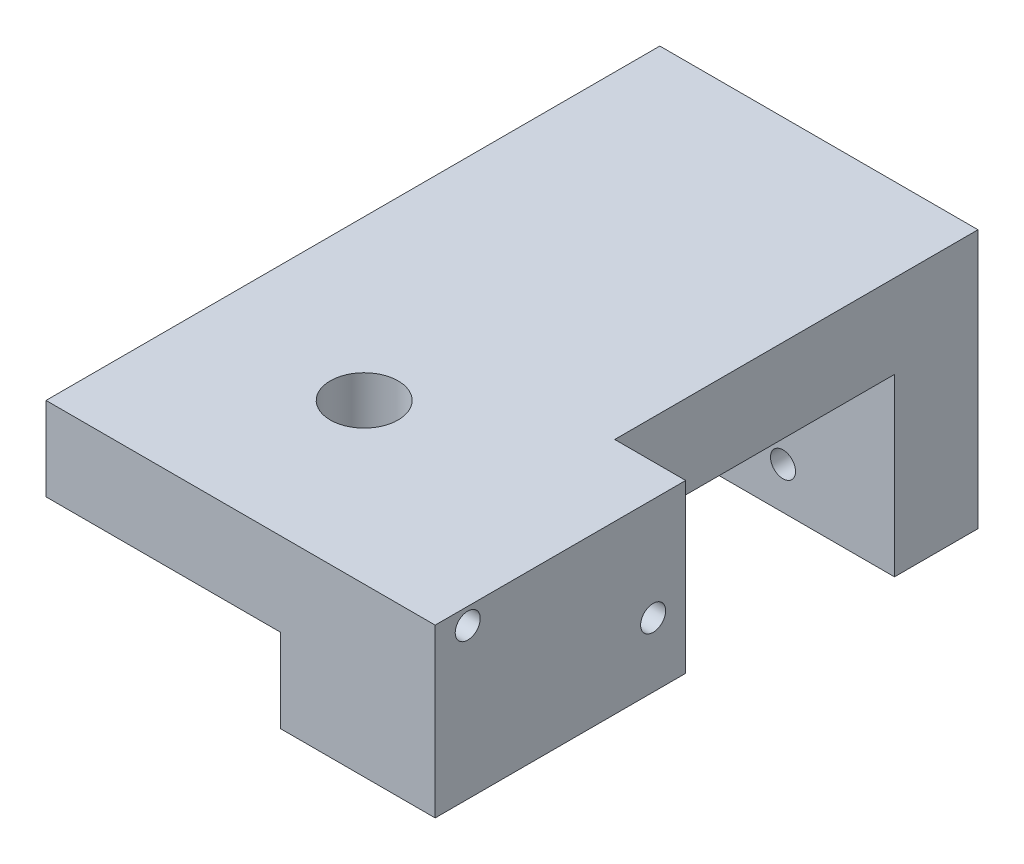
ISO-10303-21;
HEADER;
FILE_DESCRIPTION(('STEP AP214'),'2;1');
FILE_NAME('part.step','',(''),(''),'','','');
FILE_SCHEMA(('AUTOMOTIVE_DESIGN { 1 0 10303 214 1 1 1 1 }'));
ENDSEC;
DATA;
#1=APPLICATION_CONTEXT('core data for automotive mechanical design processes');
#2=APPLICATION_PROTOCOL_DEFINITION('international standard','automotive_design',2000,#1);
#3=PRODUCT_CONTEXT('',#1,'mechanical');
#4=PRODUCT('Part','Part','',(#3));
#5=PRODUCT_RELATED_PRODUCT_CATEGORY('part','',(#4));
#6=PRODUCT_DEFINITION_FORMATION('','',#4);
#7=PRODUCT_DEFINITION_CONTEXT('part definition',#1,'design');
#8=PRODUCT_DEFINITION('design','',#6,#7);
#9=PRODUCT_DEFINITION_SHAPE('','',#8);
#10=(LENGTH_UNIT() NAMED_UNIT(*) SI_UNIT(.MILLI.,.METRE.));
#11=(NAMED_UNIT(*) PLANE_ANGLE_UNIT() SI_UNIT($,.RADIAN.));
#12=(NAMED_UNIT(*) SI_UNIT($,.STERADIAN.) SOLID_ANGLE_UNIT());
#13=UNCERTAINTY_MEASURE_WITH_UNIT(LENGTH_MEASURE(1.E-05),#10,'distance_accuracy_value','');
#14=(GEOMETRIC_REPRESENTATION_CONTEXT(3) GLOBAL_UNCERTAINTY_ASSIGNED_CONTEXT((#13)) GLOBAL_UNIT_ASSIGNED_CONTEXT((#10,
#11,#12)) REPRESENTATION_CONTEXT('',''));
#15=CARTESIAN_POINT('',(0.,0.,0.));
#16=DIRECTION('',(0.,0.,1.));
#17=DIRECTION('',(1.,0.,0.));
#18=AXIS2_PLACEMENT_3D('',#15,#16,#17);
#19=CARTESIAN_POINT('',(0.,0.,0.));
#20=DIRECTION('',(0.,1.,0.));
#21=DIRECTION('',(0.,0.,1.));
#22=AXIS2_PLACEMENT_3D('',#19,#20,#21);
#23=PLANE('',#22);
#24=CARTESIAN_POINT('',(19.05,0.,44.45));
#25=DIRECTION('',(0.,1.,0.));
#26=DIRECTION('',(0.,0.,1.));
#27=AXIS2_PLACEMENT_3D('',#24,#25,#26);
#28=CIRCLE('',#27,4.064);
#29=CARTESIAN_POINT('',(19.05,0.,48.514));
#30=VERTEX_POINT('',#29);
#31=EDGE_CURVE('E248',#30,#30,#28,.T.);
#32=ORIENTED_EDGE('',*,*,#31,.T.);
#33=EDGE_LOOP('',(#32));
#34=FACE_BOUND('',#33,.T.);
#35=DIRECTION('',(0.,0.,-1.));
#36=VECTOR('',#35,1.);
#37=CARTESIAN_POINT('',(28.1,0.,0.));
#38=LINE('',#37,#36);
#39=CARTESIAN_POINT('',(28.1,0.,63.5));
#40=VERTEX_POINT('',#39);
#41=CARTESIAN_POINT('',(28.1,0.,33.5));
#42=VERTEX_POINT('',#41);
#43=EDGE_CURVE('E55',#40,#42,#38,.T.);
#44=ORIENTED_EDGE('',*,*,#43,.F.);
#45=DIRECTION('',(1.,0.,0.));
#46=VECTOR('',#45,1.);
#47=CARTESIAN_POINT('',(0.,0.,63.5));
#48=LINE('',#47,#46);
#49=CARTESIAN_POINT('',(0.,0.,63.5));
#50=VERTEX_POINT('',#49);
#51=EDGE_CURVE('E265',#50,#40,#48,.T.);
#52=ORIENTED_EDGE('',*,*,#51,.F.);
#53=DIRECTION('',(0.,0.,1.));
#54=VECTOR('',#53,1.);
#55=CARTESIAN_POINT('',(0.,0.,0.));
#56=LINE('',#55,#54);
#57=CARTESIAN_POINT('',(0.,0.,0.));
#58=VERTEX_POINT('',#57);
#59=EDGE_CURVE('E252',#58,#50,#56,.T.);
#60=ORIENTED_EDGE('',*,*,#59,.F.);
#61=DIRECTION('',(-1.,0.,0.));
#62=VECTOR('',#61,1.);
#63=CARTESIAN_POINT('',(0.,0.,0.));
#64=LINE('',#63,#62);
#65=CARTESIAN_POINT('',(38.1,0.,0.));
#66=VERTEX_POINT('',#65);
#67=EDGE_CURVE('E259',#66,#58,#64,.T.);
#68=ORIENTED_EDGE('',*,*,#67,.F.);
#69=DIRECTION('',(0.,0.,-1.));
#70=VECTOR('',#69,1.);
#71=CARTESIAN_POINT('',(38.1,0.,0.));
#72=LINE('',#71,#70);
#73=CARTESIAN_POINT('',(38.1,0.,33.5));
#74=VERTEX_POINT('',#73);
#75=EDGE_CURVE('E267',#74,#66,#72,.T.);
#76=ORIENTED_EDGE('',*,*,#75,.F.);
#77=DIRECTION('',(-1.,0.,0.));
#78=VECTOR('',#77,1.);
#79=CARTESIAN_POINT('',(0.,0.,33.5));
#80=LINE('',#79,#78);
#81=EDGE_CURVE('E51',#74,#42,#80,.T.);
#82=ORIENTED_EDGE('',*,*,#81,.T.);
#83=EDGE_LOOP('',(#44,#52,#60,#68,#76,#82));
#84=FACE_BOUND('',#83,.T.);
#85=ADVANCED_FACE('F36',(#34,#84),#23,.F.);
#86=CARTESIAN_POINT('',(38.1,10.,0.));
#87=DIRECTION('',(-1.,0.,0.));
#88=DIRECTION('',(0.,0.,1.));
#89=AXIS2_PLACEMENT_3D('',#86,#87,#88);
#90=PLANE('',#89);
#91=DIRECTION('',(0.,0.,-1.));
#92=VECTOR('',#91,1.);
#93=CARTESIAN_POINT('',(38.1,10.,0.));
#94=LINE('',#93,#92);
#95=CARTESIAN_POINT('',(38.1,10.,33.5));
#96=VERTEX_POINT('',#95);
#97=CARTESIAN_POINT('',(38.1,10.,-10.));
#98=VERTEX_POINT('',#97);
#99=EDGE_CURVE('E261',#96,#98,#94,.T.);
#100=ORIENTED_EDGE('',*,*,#99,.F.);
#101=DIRECTION('',(0.,-1.,0.));
#102=VECTOR('',#101,1.);
#103=CARTESIAN_POINT('',(38.1,10.,33.5));
#104=LINE('',#103,#102);
#105=EDGE_CURVE('E12',#96,#74,#104,.T.);
#106=ORIENTED_EDGE('',*,*,#105,.T.);
#107=ORIENTED_EDGE('',*,*,#75,.T.);
#108=DIRECTION('',(0.,-1.,0.));
#109=VECTOR('',#108,1.);
#110=CARTESIAN_POINT('',(38.1,0.,0.));
#111=LINE('',#110,#109);
#112=CARTESIAN_POINT('',(38.1,-21.,0.));
#113=VERTEX_POINT('',#112);
#114=EDGE_CURVE('E191',#66,#113,#111,.T.);
#115=ORIENTED_EDGE('',*,*,#114,.T.);
#116=DIRECTION('',(0.,0.,1.));
#117=VECTOR('',#116,1.);
#118=CARTESIAN_POINT('',(38.1,-21.,-10.));
#119=LINE('',#118,#117);
#120=CARTESIAN_POINT('',(38.1,-21.,-10.));
#121=VERTEX_POINT('',#120);
#122=EDGE_CURVE('E207',#121,#113,#119,.T.);
#123=ORIENTED_EDGE('',*,*,#122,.F.);
#124=DIRECTION('',(0.,-1.,0.));
#125=VECTOR('',#124,1.);
#126=CARTESIAN_POINT('',(38.1,0.,-10.));
#127=LINE('',#126,#125);
#128=EDGE_CURVE('E168',#98,#121,#127,.T.);
#129=ORIENTED_EDGE('',*,*,#128,.F.);
#130=EDGE_LOOP('',(#100,#106,#107,#115,#123,#129));
#131=FACE_BOUND('',#130,.T.);
#132=ADVANCED_FACE('F297',(#131),#90,.F.);
#133=CARTESIAN_POINT('',(0.,10.,0.));
#134=DIRECTION('',(0.,1.,0.));
#135=DIRECTION('',(0.,0.,1.));
#136=AXIS2_PLACEMENT_3D('',#133,#134,#135);
#137=PLANE('',#136);
#138=DIRECTION('',(1.,0.,0.));
#139=VECTOR('',#138,1.);
#140=CARTESIAN_POINT('',(0.,10.,63.5));
#141=LINE('',#140,#139);
#142=CARTESIAN_POINT('',(0.,10.,63.5));
#143=VERTEX_POINT('',#142);
#144=CARTESIAN_POINT('',(46.6,10.,63.5));
#145=VERTEX_POINT('',#144);
#146=EDGE_CURVE('E258',#143,#145,#141,.T.);
#147=ORIENTED_EDGE('',*,*,#146,.T.);
#148=DIRECTION('',(0.,0.,1.));
#149=VECTOR('',#148,1.);
#150=CARTESIAN_POINT('',(46.6,10.,0.));
#151=LINE('',#150,#149);
#152=CARTESIAN_POINT('',(46.6,10.,33.5));
#153=VERTEX_POINT('',#152);
#154=EDGE_CURVE('E216',#153,#145,#151,.T.);
#155=ORIENTED_EDGE('',*,*,#154,.F.);
#156=DIRECTION('',(1.,0.,0.));
#157=VECTOR('',#156,1.);
#158=CARTESIAN_POINT('',(28.1,10.,33.5));
#159=LINE('',#158,#157);
#160=EDGE_CURVE('E240',#96,#153,#159,.T.);
#161=ORIENTED_EDGE('',*,*,#160,.F.);
#162=ORIENTED_EDGE('',*,*,#99,.T.);
#163=DIRECTION('',(1.,0.,0.));
#164=VECTOR('',#163,1.);
#165=CARTESIAN_POINT('',(0.,10.,-10.));
#166=LINE('',#165,#164);
#167=CARTESIAN_POINT('',(0.,10.,-10.));
#168=VERTEX_POINT('',#167);
#169=EDGE_CURVE('E171',#168,#98,#166,.T.);
#170=ORIENTED_EDGE('',*,*,#169,.F.);
#171=DIRECTION('',(0.,0.,1.));
#172=VECTOR('',#171,1.);
#173=CARTESIAN_POINT('',(0.,10.,0.));
#174=LINE('',#173,#172);
#175=EDGE_CURVE('E255',#168,#143,#174,.T.);
#176=ORIENTED_EDGE('',*,*,#175,.T.);
#177=EDGE_LOOP('',(#147,#155,#161,#162,#170,#176));
#178=FACE_BOUND('',#177,.T.);
#179=CARTESIAN_POINT('',(19.05,10.,44.45));
#180=DIRECTION('',(0.,1.,0.));
#181=DIRECTION('',(0.,0.,1.));
#182=AXIS2_PLACEMENT_3D('',#179,#180,#181);
#183=CIRCLE('',#182,4.064);
#184=CARTESIAN_POINT('',(19.05,10.,48.514));
#185=VERTEX_POINT('',#184);
#186=EDGE_CURVE('E249',#185,#185,#183,.T.);
#187=ORIENTED_EDGE('',*,*,#186,.F.);
#188=EDGE_LOOP('',(#187));
#189=FACE_BOUND('',#188,.T.);
#190=ADVANCED_FACE('F303',(#178,#189),#137,.T.);
#191=CARTESIAN_POINT('',(0.,10.,0.));
#192=DIRECTION('',(1.,0.,0.));
#193=DIRECTION('',(0.,0.,-1.));
#194=AXIS2_PLACEMENT_3D('',#191,#192,#193);
#195=PLANE('',#194);
#196=CARTESIAN_POINT('',(0.,8.,59.6));
#197=DIRECTION('',(1.,0.,0.));
#198=DIRECTION('',(0.,0.,-1.));
#199=AXIS2_PLACEMENT_3D('',#196,#197,#198);
#200=CIRCLE('',#199,1.5);
#201=CARTESIAN_POINT('',(0.,8.,58.1));
#202=VERTEX_POINT('',#201);
#203=EDGE_CURVE('E582',#202,#202,#200,.T.);
#204=ORIENTED_EDGE('',*,*,#203,.T.);
#205=EDGE_LOOP('',(#204));
#206=FACE_BOUND('',#205,.T.);
#207=ORIENTED_EDGE('',*,*,#59,.T.);
#208=DIRECTION('',(0.,-1.,0.));
#209=VECTOR('',#208,1.);
#210=CARTESIAN_POINT('',(0.,10.,63.5));
#211=LINE('',#210,#209);
#212=EDGE_CURVE('E44',#143,#50,#211,.T.);
#213=ORIENTED_EDGE('',*,*,#212,.F.);
#214=ORIENTED_EDGE('',*,*,#175,.F.);
#215=DIRECTION('',(0.,-1.,0.));
#216=VECTOR('',#215,1.);
#217=CARTESIAN_POINT('',(0.,0.,-10.));
#218=LINE('',#217,#216);
#219=CARTESIAN_POINT('',(0.,-21.,-10.));
#220=VERTEX_POINT('',#219);
#221=EDGE_CURVE('E174',#168,#220,#218,.T.);
#222=ORIENTED_EDGE('',*,*,#221,.T.);
#223=DIRECTION('',(0.,0.,1.));
#224=VECTOR('',#223,1.);
#225=CARTESIAN_POINT('',(0.,-21.,-10.));
#226=LINE('',#225,#224);
#227=CARTESIAN_POINT('',(0.,-21.,0.));
#228=VERTEX_POINT('',#227);
#229=EDGE_CURVE('E204',#220,#228,#226,.T.);
#230=ORIENTED_EDGE('',*,*,#229,.T.);
#231=DIRECTION('',(0.,-1.,0.));
#232=VECTOR('',#231,1.);
#233=CARTESIAN_POINT('',(0.,0.,0.));
#234=LINE('',#233,#232);
#235=EDGE_CURVE('E194',#58,#228,#234,.T.);
#236=ORIENTED_EDGE('',*,*,#235,.F.);
#237=EDGE_LOOP('',(#207,#213,#214,#222,#230,#236));
#238=FACE_BOUND('',#237,.T.);
#239=ADVANCED_FACE('F38',(#206,#238),#195,.F.);
#240=CARTESIAN_POINT('',(0.,10.,63.5));
#241=DIRECTION('',(0.,0.,-1.));
#242=DIRECTION('',(-1.,0.,0.));
#243=AXIS2_PLACEMENT_3D('',#240,#241,#242);
#244=PLANE('',#243);
#245=DIRECTION('',(0.,-1.,0.));
#246=VECTOR('',#245,1.);
#247=CARTESIAN_POINT('',(46.6,10.,63.5));
#248=LINE('',#247,#246);
#249=CARTESIAN_POINT('',(46.6,-10.,63.5));
#250=VERTEX_POINT('',#249);
#251=EDGE_CURVE('E219',#145,#250,#248,.T.);
#252=ORIENTED_EDGE('',*,*,#251,.F.);
#253=ORIENTED_EDGE('',*,*,#146,.F.);
#254=ORIENTED_EDGE('',*,*,#212,.T.);
#255=ORIENTED_EDGE('',*,*,#51,.T.);
#256=DIRECTION('',(0.,-1.,0.));
#257=VECTOR('',#256,1.);
#258=CARTESIAN_POINT('',(28.1,10.,63.5));
#259=LINE('',#258,#257);
#260=CARTESIAN_POINT('',(28.1,-10.,63.5));
#261=VERTEX_POINT('',#260);
#262=EDGE_CURVE('E231',#40,#261,#259,.T.);
#263=ORIENTED_EDGE('',*,*,#262,.T.);
#264=DIRECTION('',(1.,0.,0.));
#265=VECTOR('',#264,1.);
#266=CARTESIAN_POINT('',(28.1,-10.,63.5));
#267=LINE('',#266,#265);
#268=EDGE_CURVE('E239',#261,#250,#267,.T.);
#269=ORIENTED_EDGE('',*,*,#268,.T.);
#270=EDGE_LOOP('',(#252,#253,#254,#255,#263,#269));
#271=FACE_BOUND('',#270,.T.);
#272=ADVANCED_FACE('F308',(#271),#244,.F.);
#273=CARTESIAN_POINT('',(19.05,10.,44.45));
#274=DIRECTION('',(0.,-1.,0.));
#275=DIRECTION('',(0.,0.,-1.));
#276=AXIS2_PLACEMENT_3D('',#273,#274,#275);
#277=CYLINDRICAL_SURFACE('',#276,4.064);
#278=ORIENTED_EDGE('',*,*,#186,.T.);
#279=EDGE_LOOP('',(#278));
#280=FACE_BOUND('',#279,.T.);
#281=ORIENTED_EDGE('',*,*,#31,.F.);
#282=EDGE_LOOP('',(#281));
#283=FACE_BOUND('',#282,.T.);
#284=ADVANCED_FACE('F310',(#280,#283),#277,.F.);
#285=CARTESIAN_POINT('',(28.1,0.,0.));
#286=DIRECTION('',(1.,0.,0.));
#287=DIRECTION('',(0.,0.,-1.));
#288=AXIS2_PLACEMENT_3D('',#285,#286,#287);
#289=PLANE('',#288);
#290=CARTESIAN_POINT('',(28.1,-2.3,37.4));
#291=DIRECTION('',(-1.,0.,0.));
#292=DIRECTION('',(0.,0.,1.));
#293=AXIS2_PLACEMENT_3D('',#290,#291,#292);
#294=CIRCLE('',#293,1.5);
#295=CARTESIAN_POINT('',(28.1,-2.3,38.9));
#296=VERTEX_POINT('',#295);
#297=EDGE_CURVE('E228',#296,#296,#294,.T.);
#298=ORIENTED_EDGE('',*,*,#297,.F.);
#299=EDGE_LOOP('',(#298));
#300=FACE_BOUND('',#299,.T.);
#301=ORIENTED_EDGE('',*,*,#262,.F.);
#302=ORIENTED_EDGE('',*,*,#43,.T.);
#303=DIRECTION('',(0.,1.,0.));
#304=VECTOR('',#303,1.);
#305=CARTESIAN_POINT('',(28.1,9.99999999999998,33.5));
#306=LINE('',#305,#304);
#307=CARTESIAN_POINT('',(28.1,-9.99999999999999,33.5));
#308=VERTEX_POINT('',#307);
#309=EDGE_CURVE('E236',#308,#42,#306,.T.);
#310=ORIENTED_EDGE('',*,*,#309,.F.);
#311=DIRECTION('',(0.,0.,-1.));
#312=VECTOR('',#311,1.);
#313=CARTESIAN_POINT('',(28.1,-9.99999999999999,0.));
#314=LINE('',#313,#312);
#315=EDGE_CURVE('E233',#261,#308,#314,.T.);
#316=ORIENTED_EDGE('',*,*,#315,.F.);
#317=EDGE_LOOP('',(#301,#302,#310,#316));
#318=FACE_BOUND('',#317,.T.);
#319=ADVANCED_FACE('F290',(#300,#318),#289,.F.);
#320=CARTESIAN_POINT('',(28.1,10.,33.5));
#321=DIRECTION('',(0.,0.,-1.));
#322=DIRECTION('',(-1.,0.,0.));
#323=AXIS2_PLACEMENT_3D('',#320,#321,#322);
#324=PLANE('',#323);
#325=ORIENTED_EDGE('',*,*,#81,.F.);
#326=ORIENTED_EDGE('',*,*,#105,.F.);
#327=ORIENTED_EDGE('',*,*,#160,.T.);
#328=DIRECTION('',(0.,1.,0.));
#329=VECTOR('',#328,1.);
#330=CARTESIAN_POINT('',(46.6,9.99999999999998,33.5));
#331=LINE('',#330,#329);
#332=CARTESIAN_POINT('',(46.6,-9.99999999999999,33.5));
#333=VERTEX_POINT('',#332);
#334=EDGE_CURVE('E225',#333,#153,#331,.T.);
#335=ORIENTED_EDGE('',*,*,#334,.F.);
#336=DIRECTION('',(1.,0.,0.));
#337=VECTOR('',#336,1.);
#338=CARTESIAN_POINT('',(28.1,-9.99999999999999,33.5));
#339=LINE('',#338,#337);
#340=EDGE_CURVE('E243',#308,#333,#339,.T.);
#341=ORIENTED_EDGE('',*,*,#340,.F.);
#342=ORIENTED_EDGE('',*,*,#309,.T.);
#343=EDGE_LOOP('',(#325,#326,#327,#335,#341,#342));
#344=FACE_BOUND('',#343,.T.);
#345=ADVANCED_FACE('F280',(#344),#324,.T.);
#346=CARTESIAN_POINT('',(28.1,8.,59.6));
#347=DIRECTION('',(1.,0.,0.));
#348=DIRECTION('',(0.,0.,-1.));
#349=AXIS2_PLACEMENT_3D('',#346,#347,#348);
#350=CYLINDRICAL_SURFACE('',#349,1.5);
#351=CARTESIAN_POINT('',(46.6,8.,59.6));
#352=DIRECTION('',(-1.,0.,0.));
#353=DIRECTION('',(0.,0.,1.));
#354=AXIS2_PLACEMENT_3D('',#351,#352,#353);
#355=CIRCLE('',#354,1.5);
#356=CARTESIAN_POINT('',(46.6,8.,61.1));
#357=VERTEX_POINT('',#356);
#358=EDGE_CURVE('E213',#357,#357,#355,.T.);
#359=ORIENTED_EDGE('',*,*,#358,.F.);
#360=EDGE_LOOP('',(#359));
#361=FACE_BOUND('',#360,.T.);
#362=CARTESIAN_POINT('',(38.1,8.,59.6));
#363=DIRECTION('',(-1.,0.,0.));
#364=DIRECTION('',(0.,0.,1.));
#365=AXIS2_PLACEMENT_3D('',#362,#363,#364);
#366=CIRCLE('',#365,1.5);
#367=CARTESIAN_POINT('',(38.1,8.,61.1));
#368=VERTEX_POINT('',#367);
#369=EDGE_CURVE('E242',#368,#368,#366,.F.);
#370=ORIENTED_EDGE('',*,*,#369,.F.);
#371=EDGE_LOOP('',(#370));
#372=FACE_BOUND('',#371,.T.);
#373=ADVANCED_FACE('F277',(#361,#372),#350,.F.);
#374=CARTESIAN_POINT('',(28.1,-9.99999999999999,0.));
#375=DIRECTION('',(0.,-1.,0.));
#376=DIRECTION('',(0.,0.,-1.));
#377=AXIS2_PLACEMENT_3D('',#374,#375,#376);
#378=PLANE('',#377);
#379=ORIENTED_EDGE('',*,*,#340,.T.);
#380=DIRECTION('',(0.,0.,-1.));
#381=VECTOR('',#380,1.);
#382=CARTESIAN_POINT('',(46.6,-9.99999999999999,0.));
#383=LINE('',#382,#381);
#384=EDGE_CURVE('E222',#250,#333,#383,.T.);
#385=ORIENTED_EDGE('',*,*,#384,.F.);
#386=ORIENTED_EDGE('',*,*,#268,.F.);
#387=ORIENTED_EDGE('',*,*,#315,.T.);
#388=EDGE_LOOP('',(#379,#385,#386,#387));
#389=FACE_BOUND('',#388,.T.);
#390=ADVANCED_FACE('F279',(#389),#378,.T.);
#391=CARTESIAN_POINT('',(28.1,-2.3,37.4));
#392=DIRECTION('',(1.,0.,0.));
#393=DIRECTION('',(0.,0.,-1.));
#394=AXIS2_PLACEMENT_3D('',#391,#392,#393);
#395=CYLINDRICAL_SURFACE('',#394,1.5);
#396=ORIENTED_EDGE('',*,*,#297,.T.);
#397=EDGE_LOOP('',(#396));
#398=FACE_BOUND('',#397,.T.);
#399=CARTESIAN_POINT('',(46.6,-2.3,37.4));
#400=DIRECTION('',(-1.,0.,0.));
#401=DIRECTION('',(0.,0.,1.));
#402=AXIS2_PLACEMENT_3D('',#399,#400,#401);
#403=CIRCLE('',#402,1.5);
#404=CARTESIAN_POINT('',(46.6,-2.3,38.9));
#405=VERTEX_POINT('',#404);
#406=EDGE_CURVE('E201',#405,#405,#403,.T.);
#407=ORIENTED_EDGE('',*,*,#406,.F.);
#408=EDGE_LOOP('',(#407));
#409=FACE_BOUND('',#408,.T.);
#410=ADVANCED_FACE('F287',(#398,#409),#395,.F.);
#411=CARTESIAN_POINT('',(46.6,0.,0.));
#412=DIRECTION('',(1.,0.,0.));
#413=DIRECTION('',(0.,0.,-1.));
#414=AXIS2_PLACEMENT_3D('',#411,#412,#413);
#415=PLANE('',#414);
#416=ORIENTED_EDGE('',*,*,#406,.T.);
#417=EDGE_LOOP('',(#416));
#418=FACE_BOUND('',#417,.T.);
#419=ORIENTED_EDGE('',*,*,#358,.T.);
#420=EDGE_LOOP('',(#419));
#421=FACE_BOUND('',#420,.T.);
#422=ORIENTED_EDGE('',*,*,#154,.T.);
#423=ORIENTED_EDGE('',*,*,#251,.T.);
#424=ORIENTED_EDGE('',*,*,#384,.T.);
#425=ORIENTED_EDGE('',*,*,#334,.T.);
#426=EDGE_LOOP('',(#422,#423,#424,#425));
#427=FACE_BOUND('',#426,.T.);
#428=ADVANCED_FACE('F323',(#418,#421,#427),#415,.T.);
#429=ORIENTED_EDGE('',*,*,#369,.T.);
#430=EDGE_LOOP('',(#429));
#431=FACE_BOUND('',#430,.T.);
#432=ADVANCED_FACE('F275',(#431),#90,.F.);
#433=CARTESIAN_POINT('',(0.,-3.,-10.));
#434=DIRECTION('',(0.,-1.,0.));
#435=DIRECTION('',(0.,0.,-1.));
#436=AXIS2_PLACEMENT_3D('',#433,#434,#435);
#437=PLANE('',#436);
#438=DIRECTION('',(1.,0.,0.));
#439=VECTOR('',#438,1.);
#440=CARTESIAN_POINT('',(0.,-3.,0.));
#441=LINE('',#440,#439);
#442=CARTESIAN_POINT('',(13.25,-3.,0.));
#443=VERTEX_POINT('',#442);
#444=CARTESIAN_POINT('',(16.25,-3.,0.));
#445=VERTEX_POINT('',#444);
#446=EDGE_CURVE('E185',#443,#445,#441,.T.);
#447=ORIENTED_EDGE('',*,*,#446,.F.);
#448=DIRECTION('',(0.,0.,1.));
#449=VECTOR('',#448,1.);
#450=CARTESIAN_POINT('',(13.25,-3.,-10.));
#451=LINE('',#450,#449);
#452=CARTESIAN_POINT('',(13.25,-3.,-10.));
#453=VERTEX_POINT('',#452);
#454=EDGE_CURVE('E159',#453,#443,#451,.T.);
#455=ORIENTED_EDGE('',*,*,#454,.F.);
#456=DIRECTION('',(1.,0.,0.));
#457=VECTOR('',#456,1.);
#458=CARTESIAN_POINT('',(0.,-3.,-10.));
#459=LINE('',#458,#457);
#460=CARTESIAN_POINT('',(16.25,-3.,-10.));
#461=VERTEX_POINT('',#460);
#462=EDGE_CURVE('E153',#453,#461,#459,.T.);
#463=ORIENTED_EDGE('',*,*,#462,.T.);
#464=DIRECTION('',(0.,0.,1.));
#465=VECTOR('',#464,1.);
#466=CARTESIAN_POINT('',(16.25,-3.,-10.));
#467=LINE('',#466,#465);
#468=EDGE_CURVE('E135',#461,#445,#467,.T.);
#469=ORIENTED_EDGE('',*,*,#468,.T.);
#470=EDGE_LOOP('',(#447,#455,#463,#469));
#471=FACE_BOUND('',#470,.T.);
#472=ADVANCED_FACE('F158',(#471),#437,.T.);
#473=CARTESIAN_POINT('',(13.25,0.,-10.));
#474=DIRECTION('',(1.,0.,0.));
#475=DIRECTION('',(0.,0.,-1.));
#476=AXIS2_PLACEMENT_3D('',#473,#474,#475);
#477=PLANE('',#476);
#478=DIRECTION('',(0.,1.,0.));
#479=VECTOR('',#478,1.);
#480=CARTESIAN_POINT('',(13.25,0.,0.));
#481=LINE('',#480,#479);
#482=CARTESIAN_POINT('',(13.25,-21.,0.));
#483=VERTEX_POINT('',#482);
#484=EDGE_CURVE('E196',#483,#443,#481,.T.);
#485=ORIENTED_EDGE('',*,*,#484,.F.);
#486=DIRECTION('',(0.,0.,1.));
#487=VECTOR('',#486,1.);
#488=CARTESIAN_POINT('',(13.25,-21.,-10.));
#489=LINE('',#488,#487);
#490=CARTESIAN_POINT('',(13.25,-21.,-10.));
#491=VERTEX_POINT('',#490);
#492=EDGE_CURVE('E202',#491,#483,#489,.T.);
#493=ORIENTED_EDGE('',*,*,#492,.F.);
#494=DIRECTION('',(0.,1.,0.));
#495=VECTOR('',#494,1.);
#496=CARTESIAN_POINT('',(13.25,0.,-10.));
#497=LINE('',#496,#495);
#498=EDGE_CURVE('E146',#491,#453,#497,.T.);
#499=ORIENTED_EDGE('',*,*,#498,.T.);
#500=ORIENTED_EDGE('',*,*,#454,.T.);
#501=EDGE_LOOP('',(#485,#493,#499,#500));
#502=FACE_BOUND('',#501,.T.);
#503=ADVANCED_FACE('F351',(#502),#477,.T.);
#504=CARTESIAN_POINT('',(0.,-21.,-10.));
#505=DIRECTION('',(0.,-1.,0.));
#506=DIRECTION('',(0.,0.,-1.));
#507=AXIS2_PLACEMENT_3D('',#504,#505,#506);
#508=PLANE('',#507);
#509=DIRECTION('',(1.,0.,0.));
#510=VECTOR('',#509,1.);
#511=CARTESIAN_POINT('',(0.,-21.,0.));
#512=LINE('',#511,#510);
#513=EDGE_CURVE('E192',#228,#483,#512,.T.);
#514=ORIENTED_EDGE('',*,*,#513,.F.);
#515=ORIENTED_EDGE('',*,*,#229,.F.);
#516=DIRECTION('',(1.,0.,0.));
#517=VECTOR('',#516,1.);
#518=CARTESIAN_POINT('',(0.,-21.,-10.));
#519=LINE('',#518,#517);
#520=EDGE_CURVE('E169',#220,#491,#519,.T.);
#521=ORIENTED_EDGE('',*,*,#520,.T.);
#522=ORIENTED_EDGE('',*,*,#492,.T.);
#523=EDGE_LOOP('',(#514,#515,#521,#522));
#524=FACE_BOUND('',#523,.T.);
#525=ADVANCED_FACE('F355',(#524),#508,.T.);
#526=CARTESIAN_POINT('',(16.25,-21.,0.));
#527=VERTEX_POINT('',#526);
#528=EDGE_CURVE('E188',#527,#113,#512,.T.);
#529=ORIENTED_EDGE('',*,*,#528,.F.);
#530=DIRECTION('',(0.,0.,1.));
#531=VECTOR('',#530,1.);
#532=CARTESIAN_POINT('',(16.25,-21.,-10.));
#533=LINE('',#532,#531);
#534=CARTESIAN_POINT('',(16.25,-21.,-10.));
#535=VERTEX_POINT('',#534);
#536=EDGE_CURVE('E145',#535,#527,#533,.T.);
#537=ORIENTED_EDGE('',*,*,#536,.F.);
#538=EDGE_CURVE('E156',#535,#121,#519,.T.);
#539=ORIENTED_EDGE('',*,*,#538,.T.);
#540=ORIENTED_EDGE('',*,*,#122,.T.);
#541=EDGE_LOOP('',(#529,#537,#539,#540));
#542=FACE_BOUND('',#541,.T.);
#543=ADVANCED_FACE('F346',(#542),#508,.T.);
#544=CARTESIAN_POINT('',(4.75,4.,-10.));
#545=DIRECTION('',(0.,0.,1.));
#546=DIRECTION('',(1.,0.,0.));
#547=AXIS2_PLACEMENT_3D('',#544,#545,#546);
#548=CYLINDRICAL_SURFACE('',#547,1.5);
#549=CARTESIAN_POINT('',(4.75,4.,-10.));
#550=DIRECTION('',(0.,0.,1.));
#551=DIRECTION('',(1.,0.,0.));
#552=AXIS2_PLACEMENT_3D('',#549,#550,#551);
#553=CIRCLE('',#552,1.5);
#554=CARTESIAN_POINT('',(6.25,4.,-10.));
#555=VERTEX_POINT('',#554);
#556=EDGE_CURVE('E160',#555,#555,#553,.T.);
#557=ORIENTED_EDGE('',*,*,#556,.F.);
#558=EDGE_LOOP('',(#557));
#559=FACE_BOUND('',#558,.T.);
#560=CARTESIAN_POINT('',(4.75,4.,10.));
#561=DIRECTION('',(0.,0.,1.));
#562=DIRECTION('',(1.,0.,0.));
#563=AXIS2_PLACEMENT_3D('',#560,#561,#562);
#564=CIRCLE('',#563,1.5);
#565=CARTESIAN_POINT('',(6.25,4.,10.));
#566=VERTEX_POINT('',#565);
#567=EDGE_CURVE('E577',#566,#566,#564,.T.);
#568=ORIENTED_EDGE('',*,*,#567,.T.);
#569=EDGE_LOOP('',(#568));
#570=FACE_BOUND('',#569,.T.);
#571=ADVANCED_FACE('F362',(#559,#570),#548,.F.);
#572=CARTESIAN_POINT('',(24.75,4.,-10.));
#573=DIRECTION('',(0.,0.,1.));
#574=DIRECTION('',(1.,0.,0.));
#575=AXIS2_PLACEMENT_3D('',#572,#573,#574);
#576=CYLINDRICAL_SURFACE('',#575,1.5);
#577=CARTESIAN_POINT('',(24.75,4.,-10.));
#578=DIRECTION('',(0.,0.,1.));
#579=DIRECTION('',(1.,0.,0.));
#580=AXIS2_PLACEMENT_3D('',#577,#578,#579);
#581=CIRCLE('',#580,1.5);
#582=CARTESIAN_POINT('',(26.25,4.,-10.));
#583=VERTEX_POINT('',#582);
#584=EDGE_CURVE('E163',#583,#583,#581,.T.);
#585=ORIENTED_EDGE('',*,*,#584,.F.);
#586=EDGE_LOOP('',(#585));
#587=FACE_BOUND('',#586,.T.);
#588=CARTESIAN_POINT('',(24.75,4.,10.));
#589=DIRECTION('',(0.,0.,1.));
#590=DIRECTION('',(1.,0.,0.));
#591=AXIS2_PLACEMENT_3D('',#588,#589,#590);
#592=CIRCLE('',#591,1.5);
#593=CARTESIAN_POINT('',(26.25,4.,10.));
#594=VERTEX_POINT('',#593);
#595=EDGE_CURVE('E579',#594,#594,#592,.T.);
#596=ORIENTED_EDGE('',*,*,#595,.T.);
#597=EDGE_LOOP('',(#596));
#598=FACE_BOUND('',#597,.T.);
#599=ADVANCED_FACE('F373',(#587,#598),#576,.F.);
#600=CARTESIAN_POINT('',(24.75,-16.,-10.));
#601=DIRECTION('',(0.,0.,1.));
#602=DIRECTION('',(1.,0.,0.));
#603=AXIS2_PLACEMENT_3D('',#600,#601,#602);
#604=CYLINDRICAL_SURFACE('',#603,1.5);
#605=CARTESIAN_POINT('',(24.75,-16.,-10.));
#606=DIRECTION('',(0.,0.,1.));
#607=DIRECTION('',(1.,0.,0.));
#608=AXIS2_PLACEMENT_3D('',#605,#606,#607);
#609=CIRCLE('',#608,1.5);
#610=CARTESIAN_POINT('',(26.25,-16.,-10.));
#611=VERTEX_POINT('',#610);
#612=EDGE_CURVE('E591',#611,#611,#609,.T.);
#613=ORIENTED_EDGE('',*,*,#612,.F.);
#614=EDGE_LOOP('',(#613));
#615=FACE_BOUND('',#614,.T.);
#616=CARTESIAN_POINT('',(24.75,-16.,0.));
#617=DIRECTION('',(0.,0.,1.));
#618=DIRECTION('',(1.,0.,0.));
#619=AXIS2_PLACEMENT_3D('',#616,#617,#618);
#620=CIRCLE('',#619,1.5);
#621=CARTESIAN_POINT('',(26.25,-16.,0.));
#622=VERTEX_POINT('',#621);
#623=EDGE_CURVE('E181',#622,#622,#620,.T.);
#624=ORIENTED_EDGE('',*,*,#623,.T.);
#625=EDGE_LOOP('',(#624));
#626=FACE_BOUND('',#625,.T.);
#627=ADVANCED_FACE('F377',(#615,#626),#604,.F.);
#628=CARTESIAN_POINT('',(4.75,-16.,-10.));
#629=DIRECTION('',(0.,0.,1.));
#630=DIRECTION('',(1.,0.,0.));
#631=AXIS2_PLACEMENT_3D('',#628,#629,#630);
#632=CYLINDRICAL_SURFACE('',#631,1.5);
#633=CARTESIAN_POINT('',(4.75,-16.,-10.));
#634=DIRECTION('',(0.,0.,1.));
#635=DIRECTION('',(1.,0.,0.));
#636=AXIS2_PLACEMENT_3D('',#633,#634,#635);
#637=CIRCLE('',#636,1.5);
#638=CARTESIAN_POINT('',(6.25,-16.,-10.));
#639=VERTEX_POINT('',#638);
#640=EDGE_CURVE('E199',#639,#639,#637,.T.);
#641=ORIENTED_EDGE('',*,*,#640,.F.);
#642=EDGE_LOOP('',(#641));
#643=FACE_BOUND('',#642,.T.);
#644=CARTESIAN_POINT('',(4.75,-16.,0.));
#645=DIRECTION('',(0.,0.,1.));
#646=DIRECTION('',(1.,0.,0.));
#647=AXIS2_PLACEMENT_3D('',#644,#645,#646);
#648=CIRCLE('',#647,1.5);
#649=CARTESIAN_POINT('',(6.25,-16.,0.));
#650=VERTEX_POINT('',#649);
#651=EDGE_CURVE('E178',#650,#650,#648,.T.);
#652=ORIENTED_EDGE('',*,*,#651,.T.);
#653=EDGE_LOOP('',(#652));
#654=FACE_BOUND('',#653,.T.);
#655=ADVANCED_FACE('F368',(#643,#654),#632,.F.);
#656=CARTESIAN_POINT('',(16.25,0.,-10.));
#657=DIRECTION('',(-1.,0.,0.));
#658=DIRECTION('',(0.,0.,1.));
#659=AXIS2_PLACEMENT_3D('',#656,#657,#658);
#660=PLANE('',#659);
#661=DIRECTION('',(0.,-1.,0.));
#662=VECTOR('',#661,1.);
#663=CARTESIAN_POINT('',(16.25,0.,0.));
#664=LINE('',#663,#662);
#665=EDGE_CURVE('E140',#445,#527,#664,.T.);
#666=ORIENTED_EDGE('',*,*,#665,.F.);
#667=ORIENTED_EDGE('',*,*,#468,.F.);
#668=DIRECTION('',(0.,-1.,0.));
#669=VECTOR('',#668,1.);
#670=CARTESIAN_POINT('',(16.25,0.,-10.));
#671=LINE('',#670,#669);
#672=EDGE_CURVE('E138',#461,#535,#671,.T.);
#673=ORIENTED_EDGE('',*,*,#672,.T.);
#674=ORIENTED_EDGE('',*,*,#536,.T.);
#675=EDGE_LOOP('',(#666,#667,#673,#674));
#676=FACE_BOUND('',#675,.T.);
#677=ADVANCED_FACE('F137',(#676),#660,.T.);
#678=CARTESIAN_POINT('',(0.,0.,-10.));
#679=DIRECTION('',(0.,0.,1.));
#680=DIRECTION('',(1.,0.,0.));
#681=AXIS2_PLACEMENT_3D('',#678,#679,#680);
#682=PLANE('',#681);
#683=ORIENTED_EDGE('',*,*,#640,.T.);
#684=EDGE_LOOP('',(#683));
#685=FACE_BOUND('',#684,.T.);
#686=ORIENTED_EDGE('',*,*,#612,.T.);
#687=EDGE_LOOP('',(#686));
#688=FACE_BOUND('',#687,.T.);
#689=ORIENTED_EDGE('',*,*,#584,.T.);
#690=EDGE_LOOP('',(#689));
#691=FACE_BOUND('',#690,.T.);
#692=ORIENTED_EDGE('',*,*,#556,.T.);
#693=EDGE_LOOP('',(#692));
#694=FACE_BOUND('',#693,.T.);
#695=ORIENTED_EDGE('',*,*,#462,.F.);
#696=ORIENTED_EDGE('',*,*,#498,.F.);
#697=ORIENTED_EDGE('',*,*,#520,.F.);
#698=ORIENTED_EDGE('',*,*,#221,.F.);
#699=ORIENTED_EDGE('',*,*,#169,.T.);
#700=ORIENTED_EDGE('',*,*,#128,.T.);
#701=ORIENTED_EDGE('',*,*,#538,.F.);
#702=ORIENTED_EDGE('',*,*,#672,.F.);
#703=EDGE_LOOP('',(#695,#696,#697,#698,#699,#700,#701,#702));
#704=FACE_BOUND('',#703,.T.);
#705=ADVANCED_FACE('F151',(#685,#688,#691,#694,#704),#682,.F.);
#706=CARTESIAN_POINT('',(0.,0.,0.));
#707=DIRECTION('',(0.,0.,1.));
#708=DIRECTION('',(1.,0.,0.));
#709=AXIS2_PLACEMENT_3D('',#706,#707,#708);
#710=PLANE('',#709);
#711=ORIENTED_EDGE('',*,*,#651,.F.);
#712=EDGE_LOOP('',(#711));
#713=FACE_BOUND('',#712,.T.);
#714=ORIENTED_EDGE('',*,*,#623,.F.);
#715=EDGE_LOOP('',(#714));
#716=FACE_BOUND('',#715,.T.);
#717=ORIENTED_EDGE('',*,*,#114,.F.);
#718=ORIENTED_EDGE('',*,*,#67,.T.);
#719=ORIENTED_EDGE('',*,*,#235,.T.);
#720=ORIENTED_EDGE('',*,*,#513,.T.);
#721=ORIENTED_EDGE('',*,*,#484,.T.);
#722=ORIENTED_EDGE('',*,*,#446,.T.);
#723=ORIENTED_EDGE('',*,*,#665,.T.);
#724=ORIENTED_EDGE('',*,*,#528,.T.);
#725=EDGE_LOOP('',(#717,#718,#719,#720,#721,#722,#723,#724));
#726=FACE_BOUND('',#725,.T.);
#727=ADVANCED_FACE('F342',(#713,#716,#726),#710,.T.);
#728=CARTESIAN_POINT('',(10.,8.,59.6));
#729=DIRECTION('',(-1.,0.,0.));
#730=DIRECTION('',(0.,0.,1.));
#731=AXIS2_PLACEMENT_3D('',#728,#729,#730);
#732=CYLINDRICAL_SURFACE('',#731,1.5);
#733=CARTESIAN_POINT('',(10.,8.,59.6));
#734=DIRECTION('',(1.,0.,0.));
#735=DIRECTION('',(0.,0.,-1.));
#736=AXIS2_PLACEMENT_3D('',#733,#734,#735);
#737=CIRCLE('',#736,1.5);
#738=CARTESIAN_POINT('',(10.,8.,58.1));
#739=VERTEX_POINT('',#738);
#740=EDGE_CURVE('E182',#739,#739,#737,.T.);
#741=ORIENTED_EDGE('',*,*,#740,.T.);
#742=EDGE_LOOP('',(#741));
#743=FACE_BOUND('',#742,.T.);
#744=ORIENTED_EDGE('',*,*,#203,.F.);
#745=EDGE_LOOP('',(#744));
#746=FACE_BOUND('',#745,.T.);
#747=ADVANCED_FACE('F514',(#743,#746),#732,.F.);
#748=CARTESIAN_POINT('',(10.,0.,0.));
#749=DIRECTION('',(1.,0.,0.));
#750=DIRECTION('',(0.,0.,-1.));
#751=AXIS2_PLACEMENT_3D('',#748,#749,#750);
#752=PLANE('',#751);
#753=ORIENTED_EDGE('',*,*,#740,.F.);
#754=EDGE_LOOP('',(#753));
#755=FACE_BOUND('',#754,.T.);
#756=ADVANCED_FACE('F529',(#755),#752,.F.);
#757=CARTESIAN_POINT('',(0.,0.,10.));
#758=DIRECTION('',(0.,0.,1.));
#759=DIRECTION('',(1.,0.,0.));
#760=AXIS2_PLACEMENT_3D('',#757,#758,#759);
#761=PLANE('',#760);
#762=ORIENTED_EDGE('',*,*,#595,.F.);
#763=EDGE_LOOP('',(#762));
#764=FACE_BOUND('',#763,.T.);
#765=ADVANCED_FACE('F539',(#764),#761,.F.);
#766=CARTESIAN_POINT('',(0.,0.,10.));
#767=DIRECTION('',(0.,0.,1.));
#768=DIRECTION('',(1.,0.,0.));
#769=AXIS2_PLACEMENT_3D('',#766,#767,#768);
#770=PLANE('',#769);
#771=ORIENTED_EDGE('',*,*,#567,.F.);
#772=EDGE_LOOP('',(#771));
#773=FACE_BOUND('',#772,.T.);
#774=ADVANCED_FACE('F561',(#773),#770,.F.);
#775=CLOSED_SHELL('',(#85,#132,#190,#239,#272,#284,#319,#345,#373,#390,#410,#428,#432,#472,#503,
#525,#543,#571,#599,#627,#655,#677,#705,#727,#747,#756,#765,#774));
#776=MANIFOLD_SOLID_BREP('B2',#775);
#777=ADVANCED_BREP_SHAPE_REPRESENTATION('',(#18,#776),#14);
#778=SHAPE_DEFINITION_REPRESENTATION(#9,#777);
ENDSEC;
END-ISO-10303-21;
